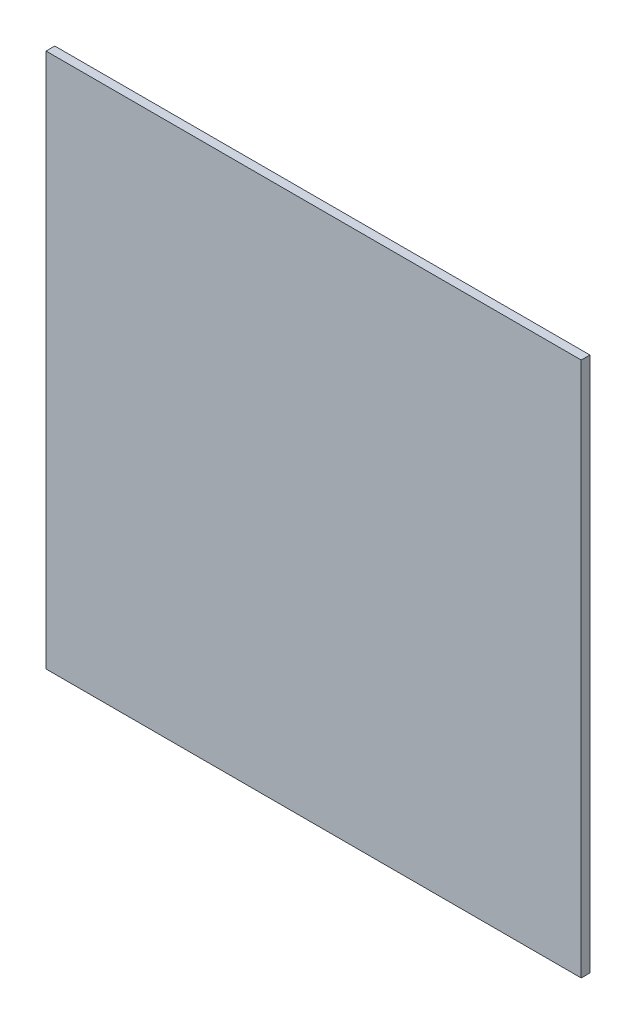
ISO-10303-21;
HEADER;
FILE_DESCRIPTION(('STEP AP214'),'2;1');
FILE_NAME('part.step','',(''),(''),'','','');
FILE_SCHEMA(('AUTOMOTIVE_DESIGN { 1 0 10303 214 1 1 1 1 }'));
ENDSEC;
DATA;
#1=APPLICATION_CONTEXT('core data for automotive mechanical design processes');
#2=APPLICATION_PROTOCOL_DEFINITION('international standard','automotive_design',2000,#1);
#3=PRODUCT_CONTEXT('',#1,'mechanical');
#4=PRODUCT('Part','Part','',(#3));
#5=PRODUCT_RELATED_PRODUCT_CATEGORY('part','',(#4));
#6=PRODUCT_DEFINITION_FORMATION('','',#4);
#7=PRODUCT_DEFINITION_CONTEXT('part definition',#1,'design');
#8=PRODUCT_DEFINITION('design','',#6,#7);
#9=PRODUCT_DEFINITION_SHAPE('','',#8);
#10=(LENGTH_UNIT() NAMED_UNIT(*) SI_UNIT(.MILLI.,.METRE.));
#11=(NAMED_UNIT(*) PLANE_ANGLE_UNIT() SI_UNIT($,.RADIAN.));
#12=(NAMED_UNIT(*) SI_UNIT($,.STERADIAN.) SOLID_ANGLE_UNIT());
#13=UNCERTAINTY_MEASURE_WITH_UNIT(LENGTH_MEASURE(1.E-05),#10,'distance_accuracy_value','');
#14=(GEOMETRIC_REPRESENTATION_CONTEXT(3) GLOBAL_UNCERTAINTY_ASSIGNED_CONTEXT((#13)) GLOBAL_UNIT_ASSIGNED_CONTEXT((#10,
#11,#12)) REPRESENTATION_CONTEXT('',''));
#15=CARTESIAN_POINT('',(0.,0.,0.));
#16=DIRECTION('',(0.,0.,1.));
#17=DIRECTION('',(1.,0.,0.));
#18=AXIS2_PLACEMENT_3D('',#15,#16,#17);
#19=CARTESIAN_POINT('',(357.539265493386,-1511.99523191401,337.273598084871));
#20=DIRECTION('',(0.,1.,0.));
#21=DIRECTION('',(0.,0.,1.));
#22=AXIS2_PLACEMENT_3D('',#19,#20,#21);
#23=PLANE('',#22);
#24=DIRECTION('',(1.,0.,0.));
#25=VECTOR('',#24,1.);
#26=CARTESIAN_POINT('',(357.539265493386,-1511.99523191401,334.27360408487));
#27=LINE('',#26,#25);
#28=CARTESIAN_POINT('',(357.539265493386,-1511.99523191401,334.27360408487));
#29=VERTEX_POINT('',#28);
#30=CARTESIAN_POINT('',(541.689265493386,-1511.99523191401,334.27360408487));
#31=VERTEX_POINT('',#30);
#32=EDGE_CURVE('E95',#29,#31,#27,.T.);
#33=ORIENTED_EDGE('',*,*,#32,.T.);
#34=DIRECTION('',(0.,0.,-1.));
#35=VECTOR('',#34,1.);
#36=CARTESIAN_POINT('',(541.689265493386,-1511.99523191401,337.273598084871));
#37=LINE('',#36,#35);
#38=CARTESIAN_POINT('',(541.689265493386,-1511.99523191401,337.273598084871));
#39=VERTEX_POINT('',#38);
#40=EDGE_CURVE('E11',#39,#31,#37,.T.);
#41=ORIENTED_EDGE('',*,*,#40,.F.);
#42=DIRECTION('',(1.,0.,0.));
#43=VECTOR('',#42,1.);
#44=CARTESIAN_POINT('',(357.539265493386,-1511.99523191401,337.273598084871));
#45=LINE('',#44,#43);
#46=CARTESIAN_POINT('',(357.539265493386,-1511.99523191401,337.273598084871));
#47=VERTEX_POINT('',#46);
#48=EDGE_CURVE('E81',#47,#39,#45,.T.);
#49=ORIENTED_EDGE('',*,*,#48,.F.);
#50=DIRECTION('',(0.,0.,-1.));
#51=VECTOR('',#50,1.);
#52=CARTESIAN_POINT('',(357.539265493386,-1511.99523191401,337.273598084871));
#53=LINE('',#52,#51);
#54=EDGE_CURVE('E48',#47,#29,#53,.T.);
#55=ORIENTED_EDGE('',*,*,#54,.T.);
#56=EDGE_LOOP('',(#33,#41,#49,#55));
#57=FACE_BOUND('',#56,.T.);
#58=ADVANCED_FACE('F32',(#57),#23,.F.);
#59=CARTESIAN_POINT('',(541.689265493386,-1511.99523191401,337.273598084871));
#60=DIRECTION('',(-1.,0.,0.));
#61=DIRECTION('',(0.,0.,1.));
#62=AXIS2_PLACEMENT_3D('',#59,#60,#61);
#63=PLANE('',#62);
#64=DIRECTION('',(0.,1.,0.));
#65=VECTOR('',#64,1.);
#66=CARTESIAN_POINT('',(541.689265493386,-1511.99523191401,334.27360408487));
#67=LINE('',#66,#65);
#68=CARTESIAN_POINT('',(541.689265493386,-1327.84523191401,334.27360408487));
#69=VERTEX_POINT('',#68);
#70=EDGE_CURVE('E86',#31,#69,#67,.T.);
#71=ORIENTED_EDGE('',*,*,#70,.T.);
#72=DIRECTION('',(0.,0.,-1.));
#73=VECTOR('',#72,1.);
#74=CARTESIAN_POINT('',(541.689265493386,-1327.84523191401,337.273598084871));
#75=LINE('',#74,#73);
#76=CARTESIAN_POINT('',(541.689265493386,-1327.84523191401,337.273598084871));
#77=VERTEX_POINT('',#76);
#78=EDGE_CURVE('E40',#77,#69,#75,.T.);
#79=ORIENTED_EDGE('',*,*,#78,.F.);
#80=DIRECTION('',(0.,1.,0.));
#81=VECTOR('',#80,1.);
#82=CARTESIAN_POINT('',(541.689265493386,-1511.99523191401,337.273598084871));
#83=LINE('',#82,#81);
#84=EDGE_CURVE('E73',#39,#77,#83,.T.);
#85=ORIENTED_EDGE('',*,*,#84,.F.);
#86=ORIENTED_EDGE('',*,*,#40,.T.);
#87=EDGE_LOOP('',(#71,#79,#85,#86));
#88=FACE_BOUND('',#87,.T.);
#89=ADVANCED_FACE('F85',(#88),#63,.F.);
#90=CARTESIAN_POINT('',(357.539265493386,-1327.84523191401,337.273598084871));
#91=DIRECTION('',(0.,1.,0.));
#92=DIRECTION('',(0.,0.,1.));
#93=AXIS2_PLACEMENT_3D('',#90,#91,#92);
#94=PLANE('',#93);
#95=DIRECTION('',(1.,0.,0.));
#96=VECTOR('',#95,1.);
#97=CARTESIAN_POINT('',(357.539265493386,-1327.84523191401,334.27360408487));
#98=LINE('',#97,#96);
#99=CARTESIAN_POINT('',(357.539265493386,-1327.84523191401,334.27360408487));
#100=VERTEX_POINT('',#99);
#101=EDGE_CURVE('E98',#100,#69,#98,.T.);
#102=ORIENTED_EDGE('',*,*,#101,.F.);
#103=DIRECTION('',(0.,0.,-1.));
#104=VECTOR('',#103,1.);
#105=CARTESIAN_POINT('',(357.539265493386,-1327.84523191401,337.273598084871));
#106=LINE('',#105,#104);
#107=CARTESIAN_POINT('',(357.539265493386,-1327.84523191401,337.273598084871));
#108=VERTEX_POINT('',#107);
#109=EDGE_CURVE('E62',#108,#100,#106,.T.);
#110=ORIENTED_EDGE('',*,*,#109,.F.);
#111=DIRECTION('',(1.,0.,0.));
#112=VECTOR('',#111,1.);
#113=CARTESIAN_POINT('',(357.539265493386,-1327.84523191401,337.273598084871));
#114=LINE('',#113,#112);
#115=EDGE_CURVE('E80',#108,#77,#114,.T.);
#116=ORIENTED_EDGE('',*,*,#115,.T.);
#117=ORIENTED_EDGE('',*,*,#78,.T.);
#118=EDGE_LOOP('',(#102,#110,#116,#117));
#119=FACE_BOUND('',#118,.T.);
#120=ADVANCED_FACE('F89',(#119),#94,.T.);
#121=CARTESIAN_POINT('',(357.539265493386,-1511.99523191401,337.273598084871));
#122=DIRECTION('',(-1.,0.,0.));
#123=DIRECTION('',(0.,0.,1.));
#124=AXIS2_PLACEMENT_3D('',#121,#122,#123);
#125=PLANE('',#124);
#126=DIRECTION('',(0.,1.,0.));
#127=VECTOR('',#126,1.);
#128=CARTESIAN_POINT('',(357.539265493386,-1511.99523191401,334.27360408487));
#129=LINE('',#128,#127);
#130=EDGE_CURVE('E100',#29,#100,#129,.T.);
#131=ORIENTED_EDGE('',*,*,#130,.F.);
#132=ORIENTED_EDGE('',*,*,#54,.F.);
#133=DIRECTION('',(0.,1.,0.));
#134=VECTOR('',#133,1.);
#135=CARTESIAN_POINT('',(357.539265493386,-1511.99523191401,337.273598084871));
#136=LINE('',#135,#134);
#137=EDGE_CURVE('E90',#47,#108,#136,.T.);
#138=ORIENTED_EDGE('',*,*,#137,.T.);
#139=ORIENTED_EDGE('',*,*,#109,.T.);
#140=EDGE_LOOP('',(#131,#132,#138,#139));
#141=FACE_BOUND('',#140,.T.);
#142=ADVANCED_FACE('F106',(#141),#125,.T.);
#143=CARTESIAN_POINT('',(0.,0.,337.273598084871));
#144=DIRECTION('',(0.,0.,1.));
#145=DIRECTION('',(1.,0.,0.));
#146=AXIS2_PLACEMENT_3D('',#143,#144,#145);
#147=PLANE('',#146);
#148=ORIENTED_EDGE('',*,*,#48,.T.);
#149=ORIENTED_EDGE('',*,*,#84,.T.);
#150=ORIENTED_EDGE('',*,*,#115,.F.);
#151=ORIENTED_EDGE('',*,*,#137,.F.);
#152=EDGE_LOOP('',(#148,#149,#150,#151));
#153=FACE_BOUND('',#152,.T.);
#154=ADVANCED_FACE('F77',(#153),#147,.T.);
#155=CARTESIAN_POINT('',(0.,0.,334.27360408487));
#156=DIRECTION('',(0.,0.,1.));
#157=DIRECTION('',(1.,0.,0.));
#158=AXIS2_PLACEMENT_3D('',#155,#156,#157);
#159=PLANE('',#158);
#160=ORIENTED_EDGE('',*,*,#32,.F.);
#161=ORIENTED_EDGE('',*,*,#130,.T.);
#162=ORIENTED_EDGE('',*,*,#101,.T.);
#163=ORIENTED_EDGE('',*,*,#70,.F.);
#164=EDGE_LOOP('',(#160,#161,#162,#163));
#165=FACE_BOUND('',#164,.T.);
#166=ADVANCED_FACE('F105',(#165),#159,.F.);
#167=CLOSED_SHELL('',(#58,#89,#120,#142,#154,#166));
#168=MANIFOLD_SOLID_BREP('B2',#167);
#169=ADVANCED_BREP_SHAPE_REPRESENTATION('',(#18,#168),#14);
#170=SHAPE_DEFINITION_REPRESENTATION(#9,#169);
ENDSEC;
END-ISO-10303-21;
